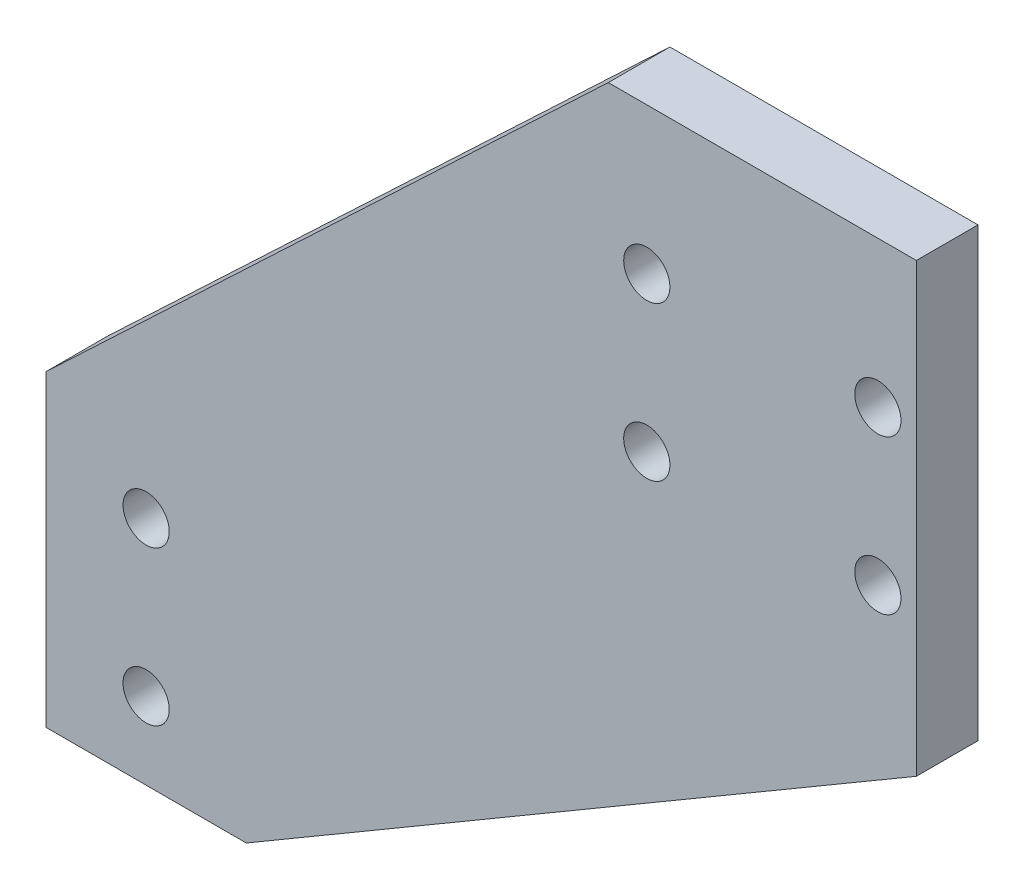
ISO-10303-21;
HEADER;
FILE_DESCRIPTION(('STEP AP214'),'2;1');
FILE_NAME('part.step','',(''),(''),'','','');
FILE_SCHEMA(('AUTOMOTIVE_DESIGN { 1 0 10303 214 1 1 1 1 }'));
ENDSEC;
DATA;
#1=APPLICATION_CONTEXT('core data for automotive mechanical design processes');
#2=APPLICATION_PROTOCOL_DEFINITION('international standard','automotive_design',2000,#1);
#3=PRODUCT_CONTEXT('',#1,'mechanical');
#4=PRODUCT('Part','Part','',(#3));
#5=PRODUCT_RELATED_PRODUCT_CATEGORY('part','',(#4));
#6=PRODUCT_DEFINITION_FORMATION('','',#4);
#7=PRODUCT_DEFINITION_CONTEXT('part definition',#1,'design');
#8=PRODUCT_DEFINITION('design','',#6,#7);
#9=PRODUCT_DEFINITION_SHAPE('','',#8);
#10=(LENGTH_UNIT() NAMED_UNIT(*) SI_UNIT(.MILLI.,.METRE.));
#11=(NAMED_UNIT(*) PLANE_ANGLE_UNIT() SI_UNIT($,.RADIAN.));
#12=(NAMED_UNIT(*) SI_UNIT($,.STERADIAN.) SOLID_ANGLE_UNIT());
#13=UNCERTAINTY_MEASURE_WITH_UNIT(LENGTH_MEASURE(1.E-05),#10,'distance_accuracy_value','');
#14=(GEOMETRIC_REPRESENTATION_CONTEXT(3) GLOBAL_UNCERTAINTY_ASSIGNED_CONTEXT((#13)) GLOBAL_UNIT_ASSIGNED_CONTEXT((#10,
#11,#12)) REPRESENTATION_CONTEXT('',''));
#15=CARTESIAN_POINT('',(0.,0.,0.));
#16=DIRECTION('',(0.,0.,1.));
#17=DIRECTION('',(1.,0.,0.));
#18=AXIS2_PLACEMENT_3D('',#15,#16,#17);
#19=CARTESIAN_POINT('',(0.,0.,4.));
#20=DIRECTION('',(0.,0.,1.));
#21=DIRECTION('',(1.,0.,0.));
#22=AXIS2_PLACEMENT_3D('',#19,#20,#21);
#23=PLANE('',#22);
#24=CARTESIAN_POINT('',(39.,45.,4.));
#25=DIRECTION('',(0.,0.,1.));
#26=DIRECTION('',(-1.,0.,0.));
#27=AXIS2_PLACEMENT_3D('',#24,#25,#26);
#28=CIRCLE('',#27,1.5);
#29=CARTESIAN_POINT('',(37.5,45.,4.));
#30=VERTEX_POINT('',#29);
#31=EDGE_CURVE('E230',#30,#30,#28,.T.);
#32=ORIENTED_EDGE('',*,*,#31,.F.);
#33=EDGE_LOOP('',(#32));
#34=FACE_BOUND('',#33,.T.);
#35=CARTESIAN_POINT('',(39.,35.,4.));
#36=DIRECTION('',(0.,0.,1.));
#37=DIRECTION('',(1.,0.,0.));
#38=AXIS2_PLACEMENT_3D('',#35,#36,#37);
#39=CIRCLE('',#38,1.5);
#40=CARTESIAN_POINT('',(40.5,35.,4.));
#41=VERTEX_POINT('',#40);
#42=EDGE_CURVE('E245',#41,#41,#39,.T.);
#43=ORIENTED_EDGE('',*,*,#42,.F.);
#44=EDGE_LOOP('',(#43));
#45=FACE_BOUND('',#44,.T.);
#46=CARTESIAN_POINT('',(6.5,15.,4.));
#47=DIRECTION('',(0.,0.,1.));
#48=DIRECTION('',(1.,0.,0.));
#49=AXIS2_PLACEMENT_3D('',#46,#47,#48);
#50=CIRCLE('',#49,1.5);
#51=CARTESIAN_POINT('',(8.,15.,4.));
#52=VERTEX_POINT('',#51);
#53=EDGE_CURVE('E142',#52,#52,#50,.T.);
#54=ORIENTED_EDGE('',*,*,#53,.F.);
#55=EDGE_LOOP('',(#54));
#56=FACE_BOUND('',#55,.T.);
#57=DIRECTION('',(0.,-1.,0.));
#58=VECTOR('',#57,1.);
#59=CARTESIAN_POINT('',(0.,20.,4.));
#60=LINE('',#59,#58);
#61=CARTESIAN_POINT('',(0.,20.,4.));
#62=VERTEX_POINT('',#61);
#63=CARTESIAN_POINT('',(0.,0.,4.));
#64=VERTEX_POINT('',#63);
#65=EDGE_CURVE('E154',#62,#64,#60,.T.);
#66=ORIENTED_EDGE('',*,*,#65,.T.);
#67=DIRECTION('',(1.,0.,0.));
#68=VECTOR('',#67,1.);
#69=CARTESIAN_POINT('',(0.,0.,4.));
#70=LINE('',#69,#68);
#71=CARTESIAN_POINT('',(13.,0.,4.));
#72=VERTEX_POINT('',#71);
#73=EDGE_CURVE('E99',#64,#72,#70,.T.);
#74=ORIENTED_EDGE('',*,*,#73,.T.);
#75=DIRECTION('',(0.862697970097658,0.50571949971242,0.));
#76=VECTOR('',#75,1.);
#77=CARTESIAN_POINT('',(13.,0.,4.));
#78=LINE('',#77,#76);
#79=CARTESIAN_POINT('',(56.5,25.5,4.));
#80=VERTEX_POINT('',#79);
#81=EDGE_CURVE('E112',#72,#80,#78,.T.);
#82=ORIENTED_EDGE('',*,*,#81,.T.);
#83=DIRECTION('',(0.,1.,0.));
#84=VECTOR('',#83,1.);
#85=CARTESIAN_POINT('',(56.5,25.5,4.));
#86=LINE('',#85,#84);
#87=CARTESIAN_POINT('',(56.5,54.5,4.));
#88=VERTEX_POINT('',#87);
#89=EDGE_CURVE('E106',#80,#88,#86,.T.);
#90=ORIENTED_EDGE('',*,*,#89,.T.);
#91=DIRECTION('',(-1.,0.,0.));
#92=VECTOR('',#91,1.);
#93=CARTESIAN_POINT('',(56.5,54.5,4.));
#94=LINE('',#93,#92);
#95=CARTESIAN_POINT('',(36.5,54.5,4.));
#96=VERTEX_POINT('',#95);
#97=EDGE_CURVE('E110',#88,#96,#94,.T.);
#98=ORIENTED_EDGE('',*,*,#97,.T.);
#99=DIRECTION('',(-0.726737008745991,-0.686915802787306,0.));
#100=VECTOR('',#99,1.);
#101=CARTESIAN_POINT('',(36.5,54.5,4.));
#102=LINE('',#101,#100);
#103=EDGE_CURVE('E62',#96,#62,#102,.T.);
#104=ORIENTED_EDGE('',*,*,#103,.T.);
#105=EDGE_LOOP('',(#66,#74,#82,#90,#98,#104));
#106=FACE_BOUND('',#105,.T.);
#107=CARTESIAN_POINT('',(6.5,5.,4.));
#108=DIRECTION('',(0.,0.,1.));
#109=DIRECTION('',(-1.,0.,0.));
#110=AXIS2_PLACEMENT_3D('',#107,#108,#109);
#111=CIRCLE('',#110,1.5);
#112=CARTESIAN_POINT('',(5.,5.,4.));
#113=VERTEX_POINT('',#112);
#114=EDGE_CURVE('E252',#113,#113,#111,.T.);
#115=ORIENTED_EDGE('',*,*,#114,.F.);
#116=EDGE_LOOP('',(#115));
#117=FACE_BOUND('',#116,.T.);
#118=CARTESIAN_POINT('',(54.,35.,4.));
#119=DIRECTION('',(0.,0.,1.));
#120=DIRECTION('',(-1.,0.,0.));
#121=AXIS2_PLACEMENT_3D('',#118,#119,#120);
#122=CIRCLE('',#121,1.5);
#123=CARTESIAN_POINT('',(52.5,35.,4.));
#124=VERTEX_POINT('',#123);
#125=EDGE_CURVE('E237',#124,#124,#122,.T.);
#126=ORIENTED_EDGE('',*,*,#125,.F.);
#127=EDGE_LOOP('',(#126));
#128=FACE_BOUND('',#127,.T.);
#129=CARTESIAN_POINT('',(54.,45.,4.));
#130=DIRECTION('',(0.,0.,1.));
#131=DIRECTION('',(1.,0.,0.));
#132=AXIS2_PLACEMENT_3D('',#129,#130,#131);
#133=CIRCLE('',#132,1.5);
#134=CARTESIAN_POINT('',(55.5,45.,4.));
#135=VERTEX_POINT('',#134);
#136=EDGE_CURVE('E218',#135,#135,#133,.T.);
#137=ORIENTED_EDGE('',*,*,#136,.F.);
#138=EDGE_LOOP('',(#137));
#139=FACE_BOUND('',#138,.T.);
#140=ADVANCED_FACE('F44',(#34,#45,#56,#106,#117,#128,#139),#23,.T.);
#141=CARTESIAN_POINT('',(0.,0.,0.));
#142=DIRECTION('',(0.,0.,1.));
#143=DIRECTION('',(1.,0.,0.));
#144=AXIS2_PLACEMENT_3D('',#141,#142,#143);
#145=PLANE('',#144);
#146=DIRECTION('',(0.,-1.,0.));
#147=VECTOR('',#146,1.);
#148=CARTESIAN_POINT('',(0.,20.,0.));
#149=LINE('',#148,#147);
#150=CARTESIAN_POINT('',(0.,20.,0.));
#151=VERTEX_POINT('',#150);
#152=CARTESIAN_POINT('',(0.,0.,0.));
#153=VERTEX_POINT('',#152);
#154=EDGE_CURVE('E137',#151,#153,#149,.T.);
#155=ORIENTED_EDGE('',*,*,#154,.F.);
#156=DIRECTION('',(-0.726737008745991,-0.686915802787306,0.));
#157=VECTOR('',#156,1.);
#158=CARTESIAN_POINT('',(36.5,54.5,0.));
#159=LINE('',#158,#157);
#160=CARTESIAN_POINT('',(36.5,54.5,0.));
#161=VERTEX_POINT('',#160);
#162=EDGE_CURVE('E91',#161,#151,#159,.T.);
#163=ORIENTED_EDGE('',*,*,#162,.F.);
#164=DIRECTION('',(-1.,0.,0.));
#165=VECTOR('',#164,1.);
#166=CARTESIAN_POINT('',(56.5,54.5,0.));
#167=LINE('',#166,#165);
#168=CARTESIAN_POINT('',(56.5,54.5,0.));
#169=VERTEX_POINT('',#168);
#170=EDGE_CURVE('E85',#169,#161,#167,.T.);
#171=ORIENTED_EDGE('',*,*,#170,.F.);
#172=DIRECTION('',(0.,1.,0.));
#173=VECTOR('',#172,1.);
#174=CARTESIAN_POINT('',(56.5,25.5,0.));
#175=LINE('',#174,#173);
#176=CARTESIAN_POINT('',(56.5,25.5,0.));
#177=VERTEX_POINT('',#176);
#178=EDGE_CURVE('E121',#177,#169,#175,.T.);
#179=ORIENTED_EDGE('',*,*,#178,.F.);
#180=DIRECTION('',(0.862697970097658,0.50571949971242,0.));
#181=VECTOR('',#180,1.);
#182=CARTESIAN_POINT('',(13.,0.,0.));
#183=LINE('',#182,#181);
#184=CARTESIAN_POINT('',(13.,0.,0.));
#185=VERTEX_POINT('',#184);
#186=EDGE_CURVE('E145',#185,#177,#183,.T.);
#187=ORIENTED_EDGE('',*,*,#186,.F.);
#188=DIRECTION('',(1.,0.,0.));
#189=VECTOR('',#188,1.);
#190=CARTESIAN_POINT('',(0.,0.,0.));
#191=LINE('',#190,#189);
#192=EDGE_CURVE('E141',#153,#185,#191,.T.);
#193=ORIENTED_EDGE('',*,*,#192,.F.);
#194=EDGE_LOOP('',(#155,#163,#171,#179,#187,#193));
#195=FACE_BOUND('',#194,.T.);
#196=CARTESIAN_POINT('',(6.5,15.,0.));
#197=DIRECTION('',(0.,0.,1.));
#198=DIRECTION('',(1.,0.,0.));
#199=AXIS2_PLACEMENT_3D('',#196,#197,#198);
#200=CIRCLE('',#199,1.5);
#201=CARTESIAN_POINT('',(8.,15.,0.));
#202=VERTEX_POINT('',#201);
#203=EDGE_CURVE('E256',#202,#202,#200,.T.);
#204=ORIENTED_EDGE('',*,*,#203,.T.);
#205=EDGE_LOOP('',(#204));
#206=FACE_BOUND('',#205,.T.);
#207=CARTESIAN_POINT('',(6.5,5.,0.));
#208=DIRECTION('',(0.,0.,1.));
#209=DIRECTION('',(-1.,0.,0.));
#210=AXIS2_PLACEMENT_3D('',#207,#208,#209);
#211=CIRCLE('',#210,1.5);
#212=CARTESIAN_POINT('',(5.,5.,0.));
#213=VERTEX_POINT('',#212);
#214=EDGE_CURVE('E249',#213,#213,#211,.T.);
#215=ORIENTED_EDGE('',*,*,#214,.T.);
#216=EDGE_LOOP('',(#215));
#217=FACE_BOUND('',#216,.T.);
#218=CARTESIAN_POINT('',(39.,35.,0.));
#219=DIRECTION('',(0.,0.,1.));
#220=DIRECTION('',(1.,0.,0.));
#221=AXIS2_PLACEMENT_3D('',#218,#219,#220);
#222=CIRCLE('',#221,1.5);
#223=CARTESIAN_POINT('',(40.5,35.,0.));
#224=VERTEX_POINT('',#223);
#225=EDGE_CURVE('E241',#224,#224,#222,.T.);
#226=ORIENTED_EDGE('',*,*,#225,.T.);
#227=EDGE_LOOP('',(#226));
#228=FACE_BOUND('',#227,.T.);
#229=CARTESIAN_POINT('',(54.,35.,0.));
#230=DIRECTION('',(0.,0.,1.));
#231=DIRECTION('',(-1.,0.,0.));
#232=AXIS2_PLACEMENT_3D('',#229,#230,#231);
#233=CIRCLE('',#232,1.5);
#234=CARTESIAN_POINT('',(52.5,35.,0.));
#235=VERTEX_POINT('',#234);
#236=EDGE_CURVE('E234',#235,#235,#233,.T.);
#237=ORIENTED_EDGE('',*,*,#236,.T.);
#238=EDGE_LOOP('',(#237));
#239=FACE_BOUND('',#238,.T.);
#240=CARTESIAN_POINT('',(39.,45.,0.));
#241=DIRECTION('',(0.,0.,1.));
#242=DIRECTION('',(-1.,0.,0.));
#243=AXIS2_PLACEMENT_3D('',#240,#241,#242);
#244=CIRCLE('',#243,1.5);
#245=CARTESIAN_POINT('',(37.5,45.,0.));
#246=VERTEX_POINT('',#245);
#247=EDGE_CURVE('E227',#246,#246,#244,.T.);
#248=ORIENTED_EDGE('',*,*,#247,.T.);
#249=EDGE_LOOP('',(#248));
#250=FACE_BOUND('',#249,.T.);
#251=CARTESIAN_POINT('',(54.,45.,0.));
#252=DIRECTION('',(0.,0.,1.));
#253=DIRECTION('',(1.,0.,0.));
#254=AXIS2_PLACEMENT_3D('',#251,#252,#253);
#255=CIRCLE('',#254,1.5);
#256=CARTESIAN_POINT('',(55.5,45.,0.));
#257=VERTEX_POINT('',#256);
#258=EDGE_CURVE('E221',#257,#257,#255,.T.);
#259=ORIENTED_EDGE('',*,*,#258,.T.);
#260=EDGE_LOOP('',(#259));
#261=FACE_BOUND('',#260,.T.);
#262=ADVANCED_FACE('F168',(#195,#206,#217,#228,#239,#250,#261),#145,.F.);
#263=CARTESIAN_POINT('',(0.,20.,4.));
#264=DIRECTION('',(1.,0.,0.));
#265=DIRECTION('',(0.,0.,-1.));
#266=AXIS2_PLACEMENT_3D('',#263,#264,#265);
#267=PLANE('',#266);
#268=ORIENTED_EDGE('',*,*,#154,.T.);
#269=DIRECTION('',(0.,0.,-1.));
#270=VECTOR('',#269,1.);
#271=CARTESIAN_POINT('',(0.,0.,4.));
#272=LINE('',#271,#270);
#273=EDGE_CURVE('E11',#64,#153,#272,.T.);
#274=ORIENTED_EDGE('',*,*,#273,.F.);
#275=ORIENTED_EDGE('',*,*,#65,.F.);
#276=DIRECTION('',(0.,0.,-1.));
#277=VECTOR('',#276,1.);
#278=CARTESIAN_POINT('',(0.,20.,4.));
#279=LINE('',#278,#277);
#280=EDGE_CURVE('E133',#62,#151,#279,.T.);
#281=ORIENTED_EDGE('',*,*,#280,.T.);
#282=EDGE_LOOP('',(#268,#274,#275,#281));
#283=FACE_BOUND('',#282,.T.);
#284=ADVANCED_FACE('F46',(#283),#267,.F.);
#285=CARTESIAN_POINT('',(0.,0.,4.));
#286=DIRECTION('',(0.,1.,0.));
#287=DIRECTION('',(0.,0.,1.));
#288=AXIS2_PLACEMENT_3D('',#285,#286,#287);
#289=PLANE('',#288);
#290=ORIENTED_EDGE('',*,*,#192,.T.);
#291=DIRECTION('',(0.,0.,-1.));
#292=VECTOR('',#291,1.);
#293=CARTESIAN_POINT('',(13.,0.,4.));
#294=LINE('',#293,#292);
#295=EDGE_CURVE('E54',#72,#185,#294,.T.);
#296=ORIENTED_EDGE('',*,*,#295,.F.);
#297=ORIENTED_EDGE('',*,*,#73,.F.);
#298=ORIENTED_EDGE('',*,*,#273,.T.);
#299=EDGE_LOOP('',(#290,#296,#297,#298));
#300=FACE_BOUND('',#299,.T.);
#301=ADVANCED_FACE('F355',(#300),#289,.F.);
#302=CARTESIAN_POINT('',(13.,0.,4.));
#303=DIRECTION('',(-0.50571949971242,0.862697970097658,0.));
#304=DIRECTION('',(-0.862697970097658,-0.50571949971242,0.));
#305=AXIS2_PLACEMENT_3D('',#302,#303,#304);
#306=PLANE('',#305);
#307=ORIENTED_EDGE('',*,*,#186,.T.);
#308=DIRECTION('',(0.,0.,-1.));
#309=VECTOR('',#308,1.);
#310=CARTESIAN_POINT('',(56.5,25.5,4.));
#311=LINE('',#310,#309);
#312=EDGE_CURVE('E123',#80,#177,#311,.T.);
#313=ORIENTED_EDGE('',*,*,#312,.F.);
#314=ORIENTED_EDGE('',*,*,#81,.F.);
#315=ORIENTED_EDGE('',*,*,#295,.T.);
#316=EDGE_LOOP('',(#307,#313,#314,#315));
#317=FACE_BOUND('',#316,.T.);
#318=ADVANCED_FACE('F165',(#317),#306,.F.);
#319=CARTESIAN_POINT('',(56.5,25.5,4.));
#320=DIRECTION('',(-1.,0.,0.));
#321=DIRECTION('',(0.,0.,1.));
#322=AXIS2_PLACEMENT_3D('',#319,#320,#321);
#323=PLANE('',#322);
#324=ORIENTED_EDGE('',*,*,#178,.T.);
#325=DIRECTION('',(0.,0.,-1.));
#326=VECTOR('',#325,1.);
#327=CARTESIAN_POINT('',(56.5,54.5,4.));
#328=LINE('',#327,#326);
#329=EDGE_CURVE('E118',#88,#169,#328,.T.);
#330=ORIENTED_EDGE('',*,*,#329,.F.);
#331=ORIENTED_EDGE('',*,*,#89,.F.);
#332=ORIENTED_EDGE('',*,*,#312,.T.);
#333=EDGE_LOOP('',(#324,#330,#331,#332));
#334=FACE_BOUND('',#333,.T.);
#335=ADVANCED_FACE('F119',(#334),#323,.F.);
#336=CARTESIAN_POINT('',(56.5,54.5,4.));
#337=DIRECTION('',(0.,-1.,0.));
#338=DIRECTION('',(1.,0.,0.));
#339=AXIS2_PLACEMENT_3D('',#336,#337,#338);
#340=PLANE('',#339);
#341=ORIENTED_EDGE('',*,*,#170,.T.);
#342=DIRECTION('',(0.,0.,-1.));
#343=VECTOR('',#342,1.);
#344=CARTESIAN_POINT('',(36.5,54.5,4.));
#345=LINE('',#344,#343);
#346=EDGE_CURVE('E124',#96,#161,#345,.T.);
#347=ORIENTED_EDGE('',*,*,#346,.F.);
#348=ORIENTED_EDGE('',*,*,#97,.F.);
#349=ORIENTED_EDGE('',*,*,#329,.T.);
#350=EDGE_LOOP('',(#341,#347,#348,#349));
#351=FACE_BOUND('',#350,.T.);
#352=ADVANCED_FACE('F126',(#351),#340,.F.);
#353=CARTESIAN_POINT('',(36.5,54.5,4.));
#354=DIRECTION('',(0.686915802787306,-0.726737008745991,0.));
#355=DIRECTION('',(0.726737008745991,0.686915802787306,0.));
#356=AXIS2_PLACEMENT_3D('',#353,#354,#355);
#357=PLANE('',#356);
#358=ORIENTED_EDGE('',*,*,#162,.T.);
#359=ORIENTED_EDGE('',*,*,#280,.F.);
#360=ORIENTED_EDGE('',*,*,#103,.F.);
#361=ORIENTED_EDGE('',*,*,#346,.T.);
#362=EDGE_LOOP('',(#358,#359,#360,#361));
#363=FACE_BOUND('',#362,.T.);
#364=ADVANCED_FACE('F173',(#363),#357,.F.);
#365=CARTESIAN_POINT('',(6.5,15.,4.));
#366=DIRECTION('',(0.,0.,-1.));
#367=DIRECTION('',(-1.,0.,0.));
#368=AXIS2_PLACEMENT_3D('',#365,#366,#367);
#369=CYLINDRICAL_SURFACE('',#368,1.5);
#370=ORIENTED_EDGE('',*,*,#53,.T.);
#371=EDGE_LOOP('',(#370));
#372=FACE_BOUND('',#371,.T.);
#373=ORIENTED_EDGE('',*,*,#203,.F.);
#374=EDGE_LOOP('',(#373));
#375=FACE_BOUND('',#374,.T.);
#376=ADVANCED_FACE('F175',(#372,#375),#369,.F.);
#377=CARTESIAN_POINT('',(6.5,5.,4.));
#378=DIRECTION('',(0.,0.,-1.));
#379=DIRECTION('',(-1.,0.,0.));
#380=AXIS2_PLACEMENT_3D('',#377,#378,#379);
#381=CYLINDRICAL_SURFACE('',#380,1.5);
#382=ORIENTED_EDGE('',*,*,#114,.T.);
#383=EDGE_LOOP('',(#382));
#384=FACE_BOUND('',#383,.T.);
#385=ORIENTED_EDGE('',*,*,#214,.F.);
#386=EDGE_LOOP('',(#385));
#387=FACE_BOUND('',#386,.T.);
#388=ADVANCED_FACE('F181',(#384,#387),#381,.F.);
#389=CARTESIAN_POINT('',(39.,35.,4.));
#390=DIRECTION('',(0.,0.,-1.));
#391=DIRECTION('',(-1.,0.,0.));
#392=AXIS2_PLACEMENT_3D('',#389,#390,#391);
#393=CYLINDRICAL_SURFACE('',#392,1.5);
#394=ORIENTED_EDGE('',*,*,#42,.T.);
#395=EDGE_LOOP('',(#394));
#396=FACE_BOUND('',#395,.T.);
#397=ORIENTED_EDGE('',*,*,#225,.F.);
#398=EDGE_LOOP('',(#397));
#399=FACE_BOUND('',#398,.T.);
#400=ADVANCED_FACE('F197',(#396,#399),#393,.F.);
#401=CARTESIAN_POINT('',(54.,35.,4.));
#402=DIRECTION('',(0.,0.,-1.));
#403=DIRECTION('',(-1.,0.,0.));
#404=AXIS2_PLACEMENT_3D('',#401,#402,#403);
#405=CYLINDRICAL_SURFACE('',#404,1.5);
#406=ORIENTED_EDGE('',*,*,#125,.T.);
#407=EDGE_LOOP('',(#406));
#408=FACE_BOUND('',#407,.T.);
#409=ORIENTED_EDGE('',*,*,#236,.F.);
#410=EDGE_LOOP('',(#409));
#411=FACE_BOUND('',#410,.T.);
#412=ADVANCED_FACE('F201',(#408,#411),#405,.F.);
#413=CARTESIAN_POINT('',(39.,45.,4.));
#414=DIRECTION('',(0.,0.,-1.));
#415=DIRECTION('',(-1.,0.,0.));
#416=AXIS2_PLACEMENT_3D('',#413,#414,#415);
#417=CYLINDRICAL_SURFACE('',#416,1.5);
#418=ORIENTED_EDGE('',*,*,#31,.T.);
#419=EDGE_LOOP('',(#418));
#420=FACE_BOUND('',#419,.T.);
#421=ORIENTED_EDGE('',*,*,#247,.F.);
#422=EDGE_LOOP('',(#421));
#423=FACE_BOUND('',#422,.T.);
#424=ADVANCED_FACE('F205',(#420,#423),#417,.F.);
#425=CARTESIAN_POINT('',(54.,45.,4.));
#426=DIRECTION('',(0.,0.,-1.));
#427=DIRECTION('',(-1.,0.,0.));
#428=AXIS2_PLACEMENT_3D('',#425,#426,#427);
#429=CYLINDRICAL_SURFACE('',#428,1.5);
#430=ORIENTED_EDGE('',*,*,#136,.T.);
#431=EDGE_LOOP('',(#430));
#432=FACE_BOUND('',#431,.T.);
#433=ORIENTED_EDGE('',*,*,#258,.F.);
#434=EDGE_LOOP('',(#433));
#435=FACE_BOUND('',#434,.T.);
#436=ADVANCED_FACE('F209',(#432,#435),#429,.F.);
#437=CLOSED_SHELL('',(#140,#262,#284,#301,#318,#335,#352,#364,#376,#388,#400,#412,#424,#436));
#438=MANIFOLD_SOLID_BREP('B2',#437);
#439=ADVANCED_BREP_SHAPE_REPRESENTATION('',(#18,#438),#14);
#440=SHAPE_DEFINITION_REPRESENTATION(#9,#439);
ENDSEC;
END-ISO-10303-21;
